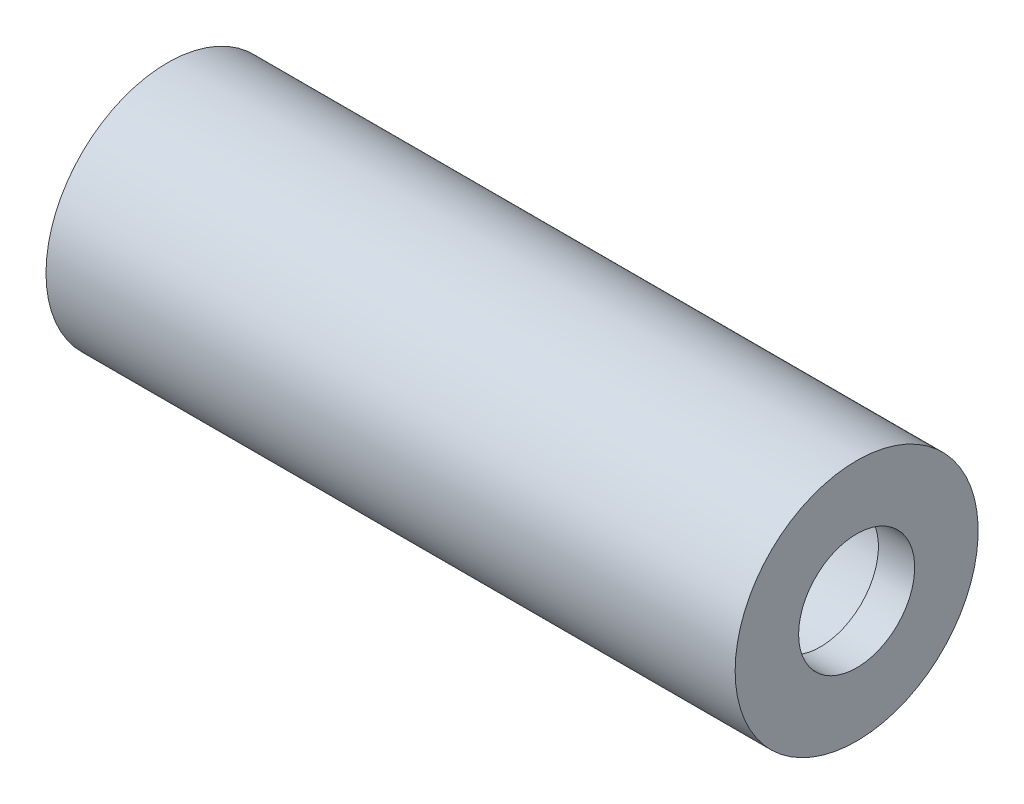
ISO-10303-21;
HEADER;
FILE_DESCRIPTION(('STEP AP214'),'2;1');
FILE_NAME('part.step','',(''),(''),'','','');
FILE_SCHEMA(('AUTOMOTIVE_DESIGN { 1 0 10303 214 1 1 1 1 }'));
ENDSEC;
DATA;
#1=APPLICATION_CONTEXT('core data for automotive mechanical design processes');
#2=APPLICATION_PROTOCOL_DEFINITION('international standard','automotive_design',2000,#1);
#3=PRODUCT_CONTEXT('',#1,'mechanical');
#4=PRODUCT('Part','Part','',(#3));
#5=PRODUCT_RELATED_PRODUCT_CATEGORY('part','',(#4));
#6=PRODUCT_DEFINITION_FORMATION('','',#4);
#7=PRODUCT_DEFINITION_CONTEXT('part definition',#1,'design');
#8=PRODUCT_DEFINITION('design','',#6,#7);
#9=PRODUCT_DEFINITION_SHAPE('','',#8);
#10=(LENGTH_UNIT() NAMED_UNIT(*) SI_UNIT(.MILLI.,.METRE.));
#11=(NAMED_UNIT(*) PLANE_ANGLE_UNIT() SI_UNIT($,.RADIAN.));
#12=(NAMED_UNIT(*) SI_UNIT($,.STERADIAN.) SOLID_ANGLE_UNIT());
#13=UNCERTAINTY_MEASURE_WITH_UNIT(LENGTH_MEASURE(1.E-05),#10,'distance_accuracy_value','');
#14=(GEOMETRIC_REPRESENTATION_CONTEXT(3) GLOBAL_UNCERTAINTY_ASSIGNED_CONTEXT((#13)) GLOBAL_UNIT_ASSIGNED_CONTEXT((#10,
#11,#12)) REPRESENTATION_CONTEXT('',''));
#15=CARTESIAN_POINT('',(0.,0.,0.));
#16=DIRECTION('',(0.,0.,1.));
#17=DIRECTION('',(1.,0.,0.));
#18=AXIS2_PLACEMENT_3D('',#15,#16,#17);
#19=CARTESIAN_POINT('',(0.,2.35,0.));
#20=DIRECTION('',(1.,0.,0.));
#21=DIRECTION('',(0.,0.,-1.));
#22=AXIS2_PLACEMENT_3D('',#19,#20,#21);
#23=PLANE('',#22);
#24=CARTESIAN_POINT('',(0.,0.,0.));
#25=DIRECTION('',(-1.,0.,0.));
#26=DIRECTION('',(0.,0.,1.));
#27=AXIS2_PLACEMENT_3D('',#24,#25,#26);
#28=CIRCLE('',#27,2.35);
#29=CARTESIAN_POINT('',(0.,0.,2.35));
#30=VERTEX_POINT('',#29);
#31=EDGE_CURVE('E55',#30,#30,#28,.T.);
#32=ORIENTED_EDGE('',*,*,#31,.F.);
#33=EDGE_LOOP('',(#32));
#34=FACE_BOUND('',#33,.T.);
#35=CARTESIAN_POINT('',(0.,0.,0.));
#36=DIRECTION('',(-1.,0.,0.));
#37=DIRECTION('',(0.,0.,1.));
#38=AXIS2_PLACEMENT_3D('',#35,#36,#37);
#39=CIRCLE('',#38,3.35);
#40=CARTESIAN_POINT('',(0.,0.,3.35));
#41=VERTEX_POINT('',#40);
#42=EDGE_CURVE('E10',#41,#41,#39,.T.);
#43=ORIENTED_EDGE('',*,*,#42,.T.);
#44=EDGE_LOOP('',(#43));
#45=FACE_BOUND('',#44,.T.);
#46=ADVANCED_FACE('F33',(#34,#45),#23,.F.);
#47=CARTESIAN_POINT('',(0.,0.,0.));
#48=DIRECTION('',(-1.,0.,0.));
#49=DIRECTION('',(0.,0.,1.));
#50=AXIS2_PLACEMENT_3D('',#47,#48,#49);
#51=CYLINDRICAL_SURFACE('',#50,3.35);
#52=ORIENTED_EDGE('',*,*,#42,.F.);
#53=EDGE_LOOP('',(#52));
#54=FACE_BOUND('',#53,.T.);
#55=CARTESIAN_POINT('',(19.,0.,0.));
#56=DIRECTION('',(-1.,0.,0.));
#57=DIRECTION('',(0.,0.,1.));
#58=AXIS2_PLACEMENT_3D('',#55,#56,#57);
#59=CIRCLE('',#58,3.35);
#60=CARTESIAN_POINT('',(19.,0.,3.35));
#61=VERTEX_POINT('',#60);
#62=EDGE_CURVE('E39',#61,#61,#59,.T.);
#63=ORIENTED_EDGE('',*,*,#62,.T.);
#64=EDGE_LOOP('',(#63));
#65=FACE_BOUND('',#64,.T.);
#66=ADVANCED_FACE('F62',(#54,#65),#51,.T.);
#67=CARTESIAN_POINT('',(19.,3.35,0.));
#68=DIRECTION('',(-1.,0.,0.));
#69=DIRECTION('',(0.,0.,1.));
#70=AXIS2_PLACEMENT_3D('',#67,#68,#69);
#71=PLANE('',#70);
#72=ORIENTED_EDGE('',*,*,#62,.F.);
#73=EDGE_LOOP('',(#72));
#74=FACE_BOUND('',#73,.T.);
#75=CARTESIAN_POINT('',(19.,0.,0.));
#76=DIRECTION('',(-1.,0.,0.));
#77=DIRECTION('',(0.,0.,1.));
#78=AXIS2_PLACEMENT_3D('',#75,#76,#77);
#79=CIRCLE('',#78,1.6);
#80=CARTESIAN_POINT('',(19.,0.,1.6));
#81=VERTEX_POINT('',#80);
#82=EDGE_CURVE('E43',#81,#81,#79,.T.);
#83=ORIENTED_EDGE('',*,*,#82,.T.);
#84=EDGE_LOOP('',(#83));
#85=FACE_BOUND('',#84,.T.);
#86=ADVANCED_FACE('F66',(#74,#85),#71,.F.);
#87=CARTESIAN_POINT('',(0.,0.,0.));
#88=DIRECTION('',(-1.,0.,0.));
#89=DIRECTION('',(0.,0.,1.));
#90=AXIS2_PLACEMENT_3D('',#87,#88,#89);
#91=CYLINDRICAL_SURFACE('',#90,1.6);
#92=ORIENTED_EDGE('',*,*,#82,.F.);
#93=EDGE_LOOP('',(#92));
#94=FACE_BOUND('',#93,.T.);
#95=CARTESIAN_POINT('',(18.,0.,0.));
#96=DIRECTION('',(-1.,0.,0.));
#97=DIRECTION('',(0.,0.,1.));
#98=AXIS2_PLACEMENT_3D('',#95,#96,#97);
#99=CIRCLE('',#98,1.6);
#100=CARTESIAN_POINT('',(18.,0.,1.6));
#101=VERTEX_POINT('',#100);
#102=EDGE_CURVE('E47',#101,#101,#99,.T.);
#103=ORIENTED_EDGE('',*,*,#102,.T.);
#104=EDGE_LOOP('',(#103));
#105=FACE_BOUND('',#104,.T.);
#106=ADVANCED_FACE('F71',(#94,#105),#91,.F.);
#107=CARTESIAN_POINT('',(18.,1.6,0.));
#108=DIRECTION('',(1.,0.,0.));
#109=DIRECTION('',(0.,0.,-1.));
#110=AXIS2_PLACEMENT_3D('',#107,#108,#109);
#111=PLANE('',#110);
#112=ORIENTED_EDGE('',*,*,#102,.F.);
#113=EDGE_LOOP('',(#112));
#114=FACE_BOUND('',#113,.T.);
#115=CARTESIAN_POINT('',(18.,0.,0.));
#116=DIRECTION('',(-1.,0.,0.));
#117=DIRECTION('',(0.,0.,1.));
#118=AXIS2_PLACEMENT_3D('',#115,#116,#117);
#119=CIRCLE('',#118,2.35);
#120=CARTESIAN_POINT('',(18.,0.,2.35));
#121=VERTEX_POINT('',#120);
#122=EDGE_CURVE('E52',#121,#121,#119,.T.);
#123=ORIENTED_EDGE('',*,*,#122,.T.);
#124=EDGE_LOOP('',(#123));
#125=FACE_BOUND('',#124,.T.);
#126=ADVANCED_FACE('F77',(#114,#125),#111,.F.);
#127=CARTESIAN_POINT('',(0.,0.,0.));
#128=DIRECTION('',(-1.,0.,0.));
#129=DIRECTION('',(0.,0.,1.));
#130=AXIS2_PLACEMENT_3D('',#127,#128,#129);
#131=CYLINDRICAL_SURFACE('',#130,2.35);
#132=ORIENTED_EDGE('',*,*,#122,.F.);
#133=EDGE_LOOP('',(#132));
#134=FACE_BOUND('',#133,.T.);
#135=ORIENTED_EDGE('',*,*,#31,.T.);
#136=EDGE_LOOP('',(#135));
#137=FACE_BOUND('',#136,.T.);
#138=ADVANCED_FACE('F59',(#134,#137),#131,.F.);
#139=CLOSED_SHELL('',(#46,#66,#86,#106,#126,#138));
#140=MANIFOLD_SOLID_BREP('B2',#139);
#141=ADVANCED_BREP_SHAPE_REPRESENTATION('',(#18,#140),#14);
#142=SHAPE_DEFINITION_REPRESENTATION(#9,#141);
ENDSEC;
END-ISO-10303-21;
